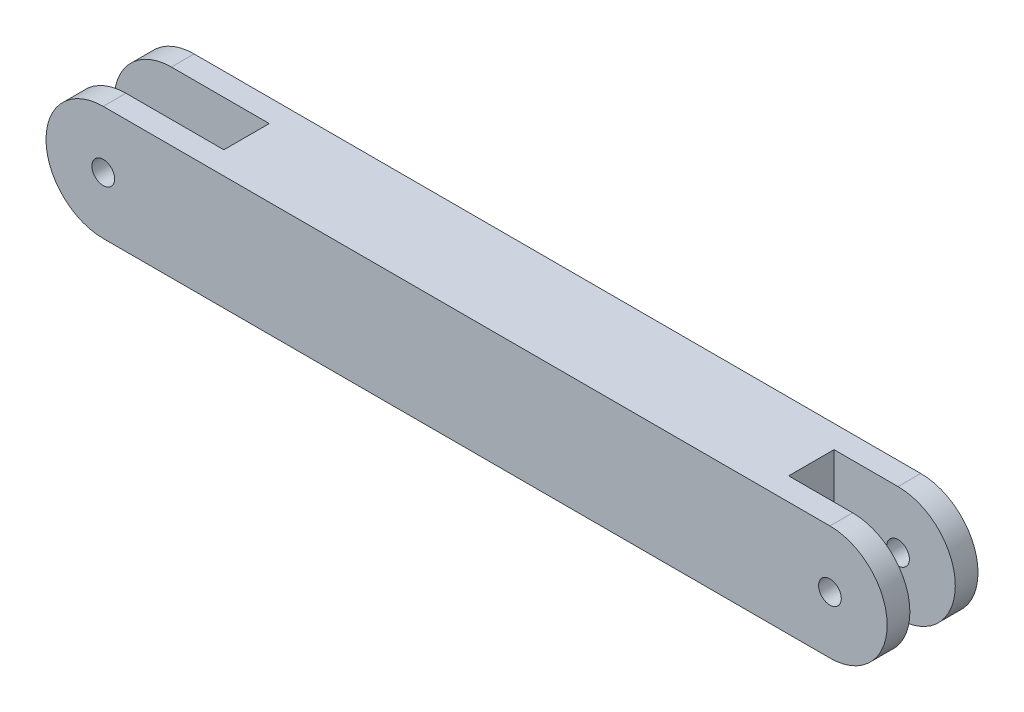
ISO-10303-21;
HEADER;
FILE_DESCRIPTION(('STEP AP214'),'2;1');
FILE_NAME('part.step','',(''),(''),'','','');
FILE_SCHEMA(('AUTOMOTIVE_DESIGN { 1 0 10303 214 1 1 1 1 }'));
ENDSEC;
DATA;
#1=APPLICATION_CONTEXT('core data for automotive mechanical design processes');
#2=APPLICATION_PROTOCOL_DEFINITION('international standard','automotive_design',2000,#1);
#3=PRODUCT_CONTEXT('',#1,'mechanical');
#4=PRODUCT('Part','Part','',(#3));
#5=PRODUCT_RELATED_PRODUCT_CATEGORY('part','',(#4));
#6=PRODUCT_DEFINITION_FORMATION('','',#4);
#7=PRODUCT_DEFINITION_CONTEXT('part definition',#1,'design');
#8=PRODUCT_DEFINITION('design','',#6,#7);
#9=PRODUCT_DEFINITION_SHAPE('','',#8);
#10=(LENGTH_UNIT() NAMED_UNIT(*) SI_UNIT(.MILLI.,.METRE.));
#11=(NAMED_UNIT(*) PLANE_ANGLE_UNIT() SI_UNIT($,.RADIAN.));
#12=(NAMED_UNIT(*) SI_UNIT($,.STERADIAN.) SOLID_ANGLE_UNIT());
#13=UNCERTAINTY_MEASURE_WITH_UNIT(LENGTH_MEASURE(1.E-05),#10,'distance_accuracy_value','');
#14=(GEOMETRIC_REPRESENTATION_CONTEXT(3) GLOBAL_UNCERTAINTY_ASSIGNED_CONTEXT((#13)) GLOBAL_UNIT_ASSIGNED_CONTEXT((#10,
#11,#12)) REPRESENTATION_CONTEXT('',''));
#15=CARTESIAN_POINT('',(0.,0.,0.));
#16=DIRECTION('',(0.,0.,1.));
#17=DIRECTION('',(1.,0.,0.));
#18=AXIS2_PLACEMENT_3D('',#15,#16,#17);
#19=CARTESIAN_POINT('',(-47.2173913043478,-8.07808695652174,6.35));
#20=DIRECTION('',(0.,0.,1.));
#21=DIRECTION('',(1.,0.,0.));
#22=AXIS2_PLACEMENT_3D('',#19,#20,#21);
#23=PLANE('',#22);
#24=DIRECTION('',(0.,1.,0.));
#25=VECTOR('',#24,1.);
#26=CARTESIAN_POINT('',(138.082608695652,-24.0800869565217,6.35));
#27=LINE('',#26,#25);
#28=CARTESIAN_POINT('',(138.082608695652,-24.0800869565217,6.35));
#29=VERTEX_POINT('',#28);
#30=CARTESIAN_POINT('',(138.082608695652,7.92391304347826,6.35));
#31=VERTEX_POINT('',#30);
#32=EDGE_CURVE('E226',#29,#31,#27,.T.);
#33=ORIENTED_EDGE('',*,*,#32,.F.);
#34=DIRECTION('',(1.,0.,0.));
#35=VECTOR('',#34,1.);
#36=CARTESIAN_POINT('',(-47.2173913043478,-24.0800869565217,6.35));
#37=LINE('',#36,#35);
#38=CARTESIAN_POINT('',(155.982608695652,-24.0800869565217,6.35));
#39=VERTEX_POINT('',#38);
#40=EDGE_CURVE('E148',#29,#39,#37,.T.);
#41=ORIENTED_EDGE('',*,*,#40,.T.);
#42=CARTESIAN_POINT('',(155.982608695652,-8.07808695652174,6.35));
#43=DIRECTION('',(0.,0.,1.));
#44=DIRECTION('',(1.,0.,0.));
#45=AXIS2_PLACEMENT_3D('',#42,#43,#44);
#46=CIRCLE('',#45,16.002);
#47=CARTESIAN_POINT('',(155.982608695652,7.92391304347826,6.35));
#48=VERTEX_POINT('',#47);
#49=EDGE_CURVE('E150',#39,#48,#46,.T.);
#50=ORIENTED_EDGE('',*,*,#49,.T.);
#51=DIRECTION('',(-1.,0.,0.));
#52=VECTOR('',#51,1.);
#53=CARTESIAN_POINT('',(-47.2173913043478,7.92391304347826,6.35));
#54=LINE('',#53,#52);
#55=EDGE_CURVE('E68',#48,#31,#54,.T.);
#56=ORIENTED_EDGE('',*,*,#55,.T.);
#57=EDGE_LOOP('',(#33,#41,#50,#56));
#58=FACE_BOUND('',#57,.T.);
#59=CARTESIAN_POINT('',(155.982608695652,-8.07808695652174,6.35));
#60=DIRECTION('',(0.,0.,1.));
#61=DIRECTION('',(1.,0.,0.));
#62=AXIS2_PLACEMENT_3D('',#59,#60,#61);
#63=CIRCLE('',#62,3.175);
#64=CARTESIAN_POINT('',(159.157608695652,-8.07808695652174,6.35));
#65=VERTEX_POINT('',#64);
#66=EDGE_CURVE('E242',#65,#65,#63,.T.);
#67=ORIENTED_EDGE('',*,*,#66,.F.);
#68=EDGE_LOOP('',(#67));
#69=FACE_BOUND('',#68,.T.);
#70=ADVANCED_FACE('F44',(#58,#69),#23,.T.);
#71=CARTESIAN_POINT('',(-47.2173913043478,-24.0800869565217,6.35));
#72=VERTEX_POINT('',#71);
#73=CARTESIAN_POINT('',(-19.8325837068269,-24.0800869565217,6.35));
#74=VERTEX_POINT('',#73);
#75=EDGE_CURVE('E138',#72,#74,#37,.T.);
#76=ORIENTED_EDGE('',*,*,#75,.T.);
#77=DIRECTION('',(0.,-1.,0.));
#78=VECTOR('',#77,1.);
#79=CARTESIAN_POINT('',(-19.8325837068269,7.92391304347826,6.35));
#80=LINE('',#79,#78);
#81=CARTESIAN_POINT('',(-19.8325837068269,7.92391304347826,6.35));
#82=VERTEX_POINT('',#81);
#83=EDGE_CURVE('E136',#82,#74,#80,.T.);
#84=ORIENTED_EDGE('',*,*,#83,.F.);
#85=CARTESIAN_POINT('',(-47.2173913043478,7.92391304347826,6.35));
#86=VERTEX_POINT('',#85);
#87=EDGE_CURVE('E262',#82,#86,#54,.T.);
#88=ORIENTED_EDGE('',*,*,#87,.T.);
#89=CARTESIAN_POINT('',(-47.2173913043478,-8.07808695652174,6.35));
#90=DIRECTION('',(0.,0.,1.));
#91=DIRECTION('',(1.,0.,0.));
#92=AXIS2_PLACEMENT_3D('',#89,#90,#91);
#93=CIRCLE('',#92,16.002);
#94=EDGE_CURVE('E141',#86,#72,#93,.T.);
#95=ORIENTED_EDGE('',*,*,#94,.T.);
#96=EDGE_LOOP('',(#76,#84,#88,#95));
#97=FACE_BOUND('',#96,.T.);
#98=CARTESIAN_POINT('',(-47.2173913043478,-8.07808695652174,6.35));
#99=DIRECTION('',(0.,0.,1.));
#100=DIRECTION('',(1.,0.,0.));
#101=AXIS2_PLACEMENT_3D('',#98,#99,#100);
#102=CIRCLE('',#101,3.175);
#103=CARTESIAN_POINT('',(-44.0423913043478,-8.07808695652174,6.35));
#104=VERTEX_POINT('',#103);
#105=EDGE_CURVE('E255',#104,#104,#102,.T.);
#106=ORIENTED_EDGE('',*,*,#105,.F.);
#107=EDGE_LOOP('',(#106));
#108=FACE_BOUND('',#107,.T.);
#109=ADVANCED_FACE('F137',(#97,#108),#23,.T.);
#110=CARTESIAN_POINT('',(-47.2173913043478,-8.07808695652174,0.));
#111=DIRECTION('',(0.,0.,1.));
#112=DIRECTION('',(1.,0.,0.));
#113=AXIS2_PLACEMENT_3D('',#110,#111,#112);
#114=PLANE('',#113);
#115=CARTESIAN_POINT('',(-47.2173913043478,-8.07808695652174,0.));
#116=DIRECTION('',(0.,0.,1.));
#117=DIRECTION('',(1.,0.,0.));
#118=AXIS2_PLACEMENT_3D('',#115,#116,#117);
#119=CIRCLE('',#118,16.002);
#120=CARTESIAN_POINT('',(-47.2173913043478,7.92391304347826,0.));
#121=VERTEX_POINT('',#120);
#122=CARTESIAN_POINT('',(-47.2173913043478,-24.0800869565217,0.));
#123=VERTEX_POINT('',#122);
#124=EDGE_CURVE('E259',#121,#123,#119,.T.);
#125=ORIENTED_EDGE('',*,*,#124,.F.);
#126=DIRECTION('',(-1.,0.,0.));
#127=VECTOR('',#126,1.);
#128=CARTESIAN_POINT('',(-47.2173913043478,7.92391304347826,0.));
#129=LINE('',#128,#127);
#130=CARTESIAN_POINT('',(155.982608695652,7.92391304347826,0.));
#131=VERTEX_POINT('',#130);
#132=EDGE_CURVE('E264',#131,#121,#129,.T.);
#133=ORIENTED_EDGE('',*,*,#132,.F.);
#134=CARTESIAN_POINT('',(155.982608695652,-8.07808695652174,0.));
#135=DIRECTION('',(0.,0.,1.));
#136=DIRECTION('',(1.,0.,0.));
#137=AXIS2_PLACEMENT_3D('',#134,#135,#136);
#138=CIRCLE('',#137,16.002);
#139=CARTESIAN_POINT('',(155.982608695652,-24.0800869565217,0.));
#140=VERTEX_POINT('',#139);
#141=EDGE_CURVE('E273',#140,#131,#138,.T.);
#142=ORIENTED_EDGE('',*,*,#141,.F.);
#143=DIRECTION('',(1.,0.,0.));
#144=VECTOR('',#143,1.);
#145=CARTESIAN_POINT('',(-47.2173913043478,-24.0800869565217,0.));
#146=LINE('',#145,#144);
#147=EDGE_CURVE('E275',#123,#140,#146,.T.);
#148=ORIENTED_EDGE('',*,*,#147,.F.);
#149=EDGE_LOOP('',(#125,#133,#142,#148));
#150=FACE_BOUND('',#149,.T.);
#151=CARTESIAN_POINT('',(-47.2173913043478,-8.07808695652174,0.));
#152=DIRECTION('',(0.,0.,1.));
#153=DIRECTION('',(1.,0.,0.));
#154=AXIS2_PLACEMENT_3D('',#151,#152,#153);
#155=CIRCLE('',#154,3.175);
#156=CARTESIAN_POINT('',(-44.0423913043478,-8.07808695652174,0.));
#157=VERTEX_POINT('',#156);
#158=EDGE_CURVE('E247',#157,#157,#155,.T.);
#159=ORIENTED_EDGE('',*,*,#158,.T.);
#160=EDGE_LOOP('',(#159));
#161=FACE_BOUND('',#160,.T.);
#162=CARTESIAN_POINT('',(155.982608695652,-8.07808695652174,0.));
#163=DIRECTION('',(0.,0.,1.));
#164=DIRECTION('',(1.,0.,0.));
#165=AXIS2_PLACEMENT_3D('',#162,#163,#164);
#166=CIRCLE('',#165,3.175);
#167=CARTESIAN_POINT('',(159.157608695652,-8.07808695652174,0.));
#168=VERTEX_POINT('',#167);
#169=EDGE_CURVE('E243',#168,#168,#166,.T.);
#170=ORIENTED_EDGE('',*,*,#169,.T.);
#171=EDGE_LOOP('',(#170));
#172=FACE_BOUND('',#171,.T.);
#173=ADVANCED_FACE('F296',(#150,#161,#172),#114,.F.);
#174=CARTESIAN_POINT('',(-47.2173913043478,-8.07808695652174,6.35));
#175=DIRECTION('',(0.,0.,-1.));
#176=DIRECTION('',(-1.,0.,0.));
#177=AXIS2_PLACEMENT_3D('',#174,#175,#176);
#178=CYLINDRICAL_SURFACE('',#177,16.002);
#179=ORIENTED_EDGE('',*,*,#124,.T.);
#180=DIRECTION('',(0.,0.,-1.));
#181=VECTOR('',#180,1.);
#182=CARTESIAN_POINT('',(-47.2173913043478,-24.0800869565217,6.35));
#183=LINE('',#182,#181);
#184=EDGE_CURVE('E11',#72,#123,#183,.T.);
#185=ORIENTED_EDGE('',*,*,#184,.F.);
#186=ORIENTED_EDGE('',*,*,#94,.F.);
#187=DIRECTION('',(0.,0.,-1.));
#188=VECTOR('',#187,1.);
#189=CARTESIAN_POINT('',(-47.2173913043478,7.92391304347826,6.35));
#190=LINE('',#189,#188);
#191=EDGE_CURVE('E267',#86,#121,#190,.T.);
#192=ORIENTED_EDGE('',*,*,#191,.T.);
#193=EDGE_LOOP('',(#179,#185,#186,#192));
#194=FACE_BOUND('',#193,.T.);
#195=ADVANCED_FACE('F50',(#194),#178,.T.);
#196=CARTESIAN_POINT('',(-47.2173913043478,-24.0800869565217,6.35));
#197=DIRECTION('',(0.,1.,0.));
#198=DIRECTION('',(0.,0.,1.));
#199=AXIS2_PLACEMENT_3D('',#196,#197,#198);
#200=PLANE('',#199);
#201=DIRECTION('',(0.,0.,1.));
#202=VECTOR('',#201,1.);
#203=CARTESIAN_POINT('',(-19.8325837068269,-24.0800869565217,6.35));
#204=LINE('',#203,#202);
#205=CARTESIAN_POINT('',(-19.8325837068269,-24.0800869565217,19.05));
#206=VERTEX_POINT('',#205);
#207=EDGE_CURVE('E153',#74,#206,#204,.T.);
#208=ORIENTED_EDGE('',*,*,#207,.F.);
#209=ORIENTED_EDGE('',*,*,#75,.F.);
#210=ORIENTED_EDGE('',*,*,#184,.T.);
#211=ORIENTED_EDGE('',*,*,#147,.T.);
#212=DIRECTION('',(0.,0.,-1.));
#213=VECTOR('',#212,1.);
#214=CARTESIAN_POINT('',(155.982608695652,-24.0800869565217,6.35));
#215=LINE('',#214,#213);
#216=EDGE_CURVE('E53',#39,#140,#215,.T.);
#217=ORIENTED_EDGE('',*,*,#216,.F.);
#218=ORIENTED_EDGE('',*,*,#40,.F.);
#219=DIRECTION('',(0.,0.,-1.));
#220=VECTOR('',#219,1.);
#221=CARTESIAN_POINT('',(138.082608695652,-24.0800869565217,19.05));
#222=LINE('',#221,#220);
#223=CARTESIAN_POINT('',(138.082608695652,-24.0800869565217,19.05));
#224=VERTEX_POINT('',#223);
#225=EDGE_CURVE('E237',#224,#29,#222,.T.);
#226=ORIENTED_EDGE('',*,*,#225,.F.);
#227=DIRECTION('',(1.,0.,0.));
#228=VECTOR('',#227,1.);
#229=CARTESIAN_POINT('',(-47.2173913043478,-24.0800869565217,19.05));
#230=LINE('',#229,#228);
#231=CARTESIAN_POINT('',(155.982608695652,-24.0800869565217,19.05));
#232=VERTEX_POINT('',#231);
#233=EDGE_CURVE('E201',#224,#232,#230,.T.);
#234=ORIENTED_EDGE('',*,*,#233,.T.);
#235=DIRECTION('',(0.,0.,-1.));
#236=VECTOR('',#235,1.);
#237=CARTESIAN_POINT('',(155.982608695652,-24.0800869565217,25.4));
#238=LINE('',#237,#236);
#239=CARTESIAN_POINT('',(155.982608695652,-24.0800869565217,25.4));
#240=VERTEX_POINT('',#239);
#241=EDGE_CURVE('E223',#240,#232,#238,.T.);
#242=ORIENTED_EDGE('',*,*,#241,.F.);
#243=DIRECTION('',(1.,0.,0.));
#244=VECTOR('',#243,1.);
#245=CARTESIAN_POINT('',(-47.2173913043478,-24.0800869565217,25.4));
#246=LINE('',#245,#244);
#247=CARTESIAN_POINT('',(-47.2173913043478,-24.0800869565217,25.4));
#248=VERTEX_POINT('',#247);
#249=EDGE_CURVE('E194',#248,#240,#246,.T.);
#250=ORIENTED_EDGE('',*,*,#249,.F.);
#251=DIRECTION('',(0.,0.,-1.));
#252=VECTOR('',#251,1.);
#253=CARTESIAN_POINT('',(-47.2173913043478,-24.0800869565217,25.4));
#254=LINE('',#253,#252);
#255=CARTESIAN_POINT('',(-47.2173913043478,-24.0800869565217,19.05));
#256=VERTEX_POINT('',#255);
#257=EDGE_CURVE('E221',#248,#256,#254,.T.);
#258=ORIENTED_EDGE('',*,*,#257,.T.);
#259=EDGE_CURVE('E163',#256,#206,#230,.T.);
#260=ORIENTED_EDGE('',*,*,#259,.T.);
#261=EDGE_LOOP('',(#208,#209,#210,#211,#217,#218,#226,#234,#242,#250,#258,#260));
#262=FACE_BOUND('',#261,.T.);
#263=ADVANCED_FACE('F160',(#262),#200,.F.);
#264=CARTESIAN_POINT('',(155.982608695652,-8.07808695652174,6.35));
#265=DIRECTION('',(0.,0.,-1.));
#266=DIRECTION('',(-1.,0.,0.));
#267=AXIS2_PLACEMENT_3D('',#264,#265,#266);
#268=CYLINDRICAL_SURFACE('',#267,16.002);
#269=ORIENTED_EDGE('',*,*,#141,.T.);
#270=DIRECTION('',(0.,0.,-1.));
#271=VECTOR('',#270,1.);
#272=CARTESIAN_POINT('',(155.982608695652,7.92391304347826,6.35));
#273=LINE('',#272,#271);
#274=EDGE_CURVE('E285',#48,#131,#273,.T.);
#275=ORIENTED_EDGE('',*,*,#274,.F.);
#276=ORIENTED_EDGE('',*,*,#49,.F.);
#277=ORIENTED_EDGE('',*,*,#216,.T.);
#278=EDGE_LOOP('',(#269,#275,#276,#277));
#279=FACE_BOUND('',#278,.T.);
#280=ADVANCED_FACE('F292',(#279),#268,.T.);
#281=CARTESIAN_POINT('',(-47.2173913043478,7.92391304347826,6.35));
#282=DIRECTION('',(0.,-1.,0.));
#283=DIRECTION('',(0.,0.,-1.));
#284=AXIS2_PLACEMENT_3D('',#281,#282,#283);
#285=PLANE('',#284);
#286=DIRECTION('',(0.,0.,-1.));
#287=VECTOR('',#286,1.);
#288=CARTESIAN_POINT('',(-19.8325837068269,7.92391304347826,6.35));
#289=LINE('',#288,#287);
#290=CARTESIAN_POINT('',(-19.8325837068269,7.92391304347826,19.05));
#291=VERTEX_POINT('',#290);
#292=EDGE_CURVE('E158',#291,#82,#289,.T.);
#293=ORIENTED_EDGE('',*,*,#292,.F.);
#294=DIRECTION('',(-1.,0.,0.));
#295=VECTOR('',#294,1.);
#296=CARTESIAN_POINT('',(-47.2173913043478,7.92391304347826,19.05));
#297=LINE('',#296,#295);
#298=CARTESIAN_POINT('',(-47.2173913043478,7.92391304347826,19.05));
#299=VERTEX_POINT('',#298);
#300=EDGE_CURVE('E64',#291,#299,#297,.T.);
#301=ORIENTED_EDGE('',*,*,#300,.T.);
#302=DIRECTION('',(0.,0.,-1.));
#303=VECTOR('',#302,1.);
#304=CARTESIAN_POINT('',(-47.2173913043478,7.92391304347826,25.4));
#305=LINE('',#304,#303);
#306=CARTESIAN_POINT('',(-47.2173913043478,7.92391304347826,25.4));
#307=VERTEX_POINT('',#306);
#308=EDGE_CURVE('E203',#307,#299,#305,.T.);
#309=ORIENTED_EDGE('',*,*,#308,.F.);
#310=DIRECTION('',(-1.,0.,0.));
#311=VECTOR('',#310,1.);
#312=CARTESIAN_POINT('',(-47.2173913043478,7.92391304347826,25.4));
#313=LINE('',#312,#311);
#314=CARTESIAN_POINT('',(155.982608695652,7.92391304347826,25.4));
#315=VERTEX_POINT('',#314);
#316=EDGE_CURVE('E200',#315,#307,#313,.T.);
#317=ORIENTED_EDGE('',*,*,#316,.F.);
#318=DIRECTION('',(0.,0.,-1.));
#319=VECTOR('',#318,1.);
#320=CARTESIAN_POINT('',(155.982608695652,7.92391304347826,25.4));
#321=LINE('',#320,#319);
#322=CARTESIAN_POINT('',(155.982608695652,7.92391304347826,19.05));
#323=VERTEX_POINT('',#322);
#324=EDGE_CURVE('E216',#315,#323,#321,.T.);
#325=ORIENTED_EDGE('',*,*,#324,.T.);
#326=CARTESIAN_POINT('',(138.082608695652,7.92391304347826,19.05));
#327=VERTEX_POINT('',#326);
#328=EDGE_CURVE('E191',#323,#327,#297,.T.);
#329=ORIENTED_EDGE('',*,*,#328,.T.);
#330=DIRECTION('',(0.,0.,-1.));
#331=VECTOR('',#330,1.);
#332=CARTESIAN_POINT('',(138.082608695652,7.92391304347826,19.05));
#333=LINE('',#332,#331);
#334=EDGE_CURVE('E231',#327,#31,#333,.T.);
#335=ORIENTED_EDGE('',*,*,#334,.T.);
#336=ORIENTED_EDGE('',*,*,#55,.F.);
#337=ORIENTED_EDGE('',*,*,#274,.T.);
#338=ORIENTED_EDGE('',*,*,#132,.T.);
#339=ORIENTED_EDGE('',*,*,#191,.F.);
#340=ORIENTED_EDGE('',*,*,#87,.F.);
#341=EDGE_LOOP('',(#293,#301,#309,#317,#325,#329,#335,#336,#337,#338,#339,#340));
#342=FACE_BOUND('',#341,.T.);
#343=ADVANCED_FACE('F305',(#342),#285,.F.);
#344=CARTESIAN_POINT('',(-47.2173913043478,-8.07808695652174,6.35));
#345=DIRECTION('',(0.,0.,-1.));
#346=DIRECTION('',(-1.,0.,0.));
#347=AXIS2_PLACEMENT_3D('',#344,#345,#346);
#348=CYLINDRICAL_SURFACE('',#347,3.175);
#349=ORIENTED_EDGE('',*,*,#105,.T.);
#350=EDGE_LOOP('',(#349));
#351=FACE_BOUND('',#350,.T.);
#352=ORIENTED_EDGE('',*,*,#158,.F.);
#353=EDGE_LOOP('',(#352));
#354=FACE_BOUND('',#353,.T.);
#355=ADVANCED_FACE('F318',(#351,#354),#348,.F.);
#356=CARTESIAN_POINT('',(155.982608695652,-8.07808695652174,6.35));
#357=DIRECTION('',(0.,0.,-1.));
#358=DIRECTION('',(-1.,0.,0.));
#359=AXIS2_PLACEMENT_3D('',#356,#357,#358);
#360=CYLINDRICAL_SURFACE('',#359,3.175);
#361=ORIENTED_EDGE('',*,*,#66,.T.);
#362=EDGE_LOOP('',(#361));
#363=FACE_BOUND('',#362,.T.);
#364=ORIENTED_EDGE('',*,*,#169,.F.);
#365=EDGE_LOOP('',(#364));
#366=FACE_BOUND('',#365,.T.);
#367=ADVANCED_FACE('F331',(#363,#366),#360,.F.);
#368=CARTESIAN_POINT('',(138.082608695652,-24.0800869565217,19.05));
#369=DIRECTION('',(-1.,0.,0.));
#370=DIRECTION('',(0.,0.,1.));
#371=AXIS2_PLACEMENT_3D('',#368,#369,#370);
#372=PLANE('',#371);
#373=ORIENTED_EDGE('',*,*,#32,.T.);
#374=ORIENTED_EDGE('',*,*,#334,.F.);
#375=DIRECTION('',(0.,1.,0.));
#376=VECTOR('',#375,1.);
#377=CARTESIAN_POINT('',(138.082608695652,-24.0800869565217,19.05));
#378=LINE('',#377,#376);
#379=EDGE_CURVE('E230',#224,#327,#378,.T.);
#380=ORIENTED_EDGE('',*,*,#379,.F.);
#381=ORIENTED_EDGE('',*,*,#225,.T.);
#382=EDGE_LOOP('',(#373,#374,#380,#381));
#383=FACE_BOUND('',#382,.T.);
#384=ADVANCED_FACE('F341',(#383),#372,.F.);
#385=CARTESIAN_POINT('',(-47.2173913043478,-8.07808695652174,19.05));
#386=DIRECTION('',(0.,0.,1.));
#387=DIRECTION('',(1.,0.,0.));
#388=AXIS2_PLACEMENT_3D('',#385,#386,#387);
#389=PLANE('',#388);
#390=CARTESIAN_POINT('',(-47.2173913043478,-8.07808695652174,19.05));
#391=DIRECTION('',(0.,0.,1.));
#392=DIRECTION('',(1.,0.,0.));
#393=AXIS2_PLACEMENT_3D('',#390,#391,#392);
#394=CIRCLE('',#393,3.175);
#395=CARTESIAN_POINT('',(-44.0423913043478,-8.07808695652174,19.05));
#396=VERTEX_POINT('',#395);
#397=EDGE_CURVE('E174',#396,#396,#394,.T.);
#398=ORIENTED_EDGE('',*,*,#397,.T.);
#399=EDGE_LOOP('',(#398));
#400=FACE_BOUND('',#399,.T.);
#401=ORIENTED_EDGE('',*,*,#300,.F.);
#402=DIRECTION('',(0.,1.,0.));
#403=VECTOR('',#402,1.);
#404=CARTESIAN_POINT('',(-19.8325837068269,7.92391304347826,19.05));
#405=LINE('',#404,#403);
#406=EDGE_CURVE('E161',#206,#291,#405,.T.);
#407=ORIENTED_EDGE('',*,*,#406,.F.);
#408=ORIENTED_EDGE('',*,*,#259,.F.);
#409=CARTESIAN_POINT('',(-47.2173913043478,-8.07808695652174,19.05));
#410=DIRECTION('',(0.,0.,1.));
#411=DIRECTION('',(1.,0.,0.));
#412=AXIS2_PLACEMENT_3D('',#409,#410,#411);
#413=CIRCLE('',#412,16.002);
#414=EDGE_CURVE('E182',#299,#256,#413,.T.);
#415=ORIENTED_EDGE('',*,*,#414,.F.);
#416=EDGE_LOOP('',(#401,#407,#408,#415));
#417=FACE_BOUND('',#416,.T.);
#418=ADVANCED_FACE('F374',(#400,#417),#389,.F.);
#419=CARTESIAN_POINT('',(155.982608695652,-8.07808695652174,19.05));
#420=DIRECTION('',(0.,0.,1.));
#421=DIRECTION('',(1.,0.,0.));
#422=AXIS2_PLACEMENT_3D('',#419,#420,#421);
#423=CIRCLE('',#422,3.175);
#424=CARTESIAN_POINT('',(159.157608695652,-8.07808695652174,19.05));
#425=VERTEX_POINT('',#424);
#426=EDGE_CURVE('E167',#425,#425,#423,.T.);
#427=ORIENTED_EDGE('',*,*,#426,.T.);
#428=EDGE_LOOP('',(#427));
#429=FACE_BOUND('',#428,.T.);
#430=ORIENTED_EDGE('',*,*,#233,.F.);
#431=ORIENTED_EDGE('',*,*,#379,.T.);
#432=ORIENTED_EDGE('',*,*,#328,.F.);
#433=CARTESIAN_POINT('',(155.982608695652,-8.07808695652174,19.05));
#434=DIRECTION('',(0.,0.,1.));
#435=DIRECTION('',(1.,0.,0.));
#436=AXIS2_PLACEMENT_3D('',#433,#434,#435);
#437=CIRCLE('',#436,16.002);
#438=EDGE_CURVE('E206',#232,#323,#437,.T.);
#439=ORIENTED_EDGE('',*,*,#438,.F.);
#440=EDGE_LOOP('',(#430,#431,#432,#439));
#441=FACE_BOUND('',#440,.T.);
#442=ADVANCED_FACE('F385',(#429,#441),#389,.F.);
#443=CARTESIAN_POINT('',(-47.2173913043478,-8.07808695652174,25.4));
#444=DIRECTION('',(0.,0.,1.));
#445=DIRECTION('',(1.,0.,0.));
#446=AXIS2_PLACEMENT_3D('',#443,#444,#445);
#447=PLANE('',#446);
#448=CARTESIAN_POINT('',(-47.2173913043478,-8.07808695652174,25.4));
#449=DIRECTION('',(0.,0.,1.));
#450=DIRECTION('',(1.,0.,0.));
#451=AXIS2_PLACEMENT_3D('',#448,#449,#450);
#452=CIRCLE('',#451,3.175);
#453=CARTESIAN_POINT('',(-44.0423913043478,-8.07808695652174,25.4));
#454=VERTEX_POINT('',#453);
#455=EDGE_CURVE('E177',#454,#454,#452,.T.);
#456=ORIENTED_EDGE('',*,*,#455,.F.);
#457=EDGE_LOOP('',(#456));
#458=FACE_BOUND('',#457,.T.);
#459=CARTESIAN_POINT('',(-47.2173913043478,-8.07808695652174,25.4));
#460=DIRECTION('',(0.,0.,1.));
#461=DIRECTION('',(1.,0.,0.));
#462=AXIS2_PLACEMENT_3D('',#459,#460,#461);
#463=CIRCLE('',#462,16.002);
#464=EDGE_CURVE('E190',#307,#248,#463,.T.);
#465=ORIENTED_EDGE('',*,*,#464,.T.);
#466=ORIENTED_EDGE('',*,*,#249,.T.);
#467=CARTESIAN_POINT('',(155.982608695652,-8.07808695652174,25.4));
#468=DIRECTION('',(0.,0.,1.));
#469=DIRECTION('',(1.,0.,0.));
#470=AXIS2_PLACEMENT_3D('',#467,#468,#469);
#471=CIRCLE('',#470,16.002);
#472=EDGE_CURVE('E192',#240,#315,#471,.T.);
#473=ORIENTED_EDGE('',*,*,#472,.T.);
#474=ORIENTED_EDGE('',*,*,#316,.T.);
#475=EDGE_LOOP('',(#465,#466,#473,#474));
#476=FACE_BOUND('',#475,.T.);
#477=CARTESIAN_POINT('',(155.982608695652,-8.07808695652174,25.4));
#478=DIRECTION('',(0.,0.,1.));
#479=DIRECTION('',(1.,0.,0.));
#480=AXIS2_PLACEMENT_3D('',#477,#478,#479);
#481=CIRCLE('',#480,3.175);
#482=CARTESIAN_POINT('',(159.157608695652,-8.07808695652174,25.4));
#483=VERTEX_POINT('',#482);
#484=EDGE_CURVE('E171',#483,#483,#481,.T.);
#485=ORIENTED_EDGE('',*,*,#484,.F.);
#486=EDGE_LOOP('',(#485));
#487=FACE_BOUND('',#486,.T.);
#488=ADVANCED_FACE('F389',(#458,#476,#487),#447,.T.);
#489=CARTESIAN_POINT('',(-47.2173913043478,-8.07808695652174,25.4));
#490=DIRECTION('',(0.,0.,-1.));
#491=DIRECTION('',(-1.,0.,0.));
#492=AXIS2_PLACEMENT_3D('',#489,#490,#491);
#493=CYLINDRICAL_SURFACE('',#492,16.002);
#494=ORIENTED_EDGE('',*,*,#414,.T.);
#495=ORIENTED_EDGE('',*,*,#257,.F.);
#496=ORIENTED_EDGE('',*,*,#464,.F.);
#497=ORIENTED_EDGE('',*,*,#308,.T.);
#498=EDGE_LOOP('',(#494,#495,#496,#497));
#499=FACE_BOUND('',#498,.T.);
#500=ADVANCED_FACE('F392',(#499),#493,.T.);
#501=CARTESIAN_POINT('',(155.982608695652,-8.07808695652174,25.4));
#502=DIRECTION('',(0.,0.,-1.));
#503=DIRECTION('',(-1.,0.,0.));
#504=AXIS2_PLACEMENT_3D('',#501,#502,#503);
#505=CYLINDRICAL_SURFACE('',#504,16.002);
#506=ORIENTED_EDGE('',*,*,#438,.T.);
#507=ORIENTED_EDGE('',*,*,#324,.F.);
#508=ORIENTED_EDGE('',*,*,#472,.F.);
#509=ORIENTED_EDGE('',*,*,#241,.T.);
#510=EDGE_LOOP('',(#506,#507,#508,#509));
#511=FACE_BOUND('',#510,.T.);
#512=ADVANCED_FACE('F404',(#511),#505,.T.);
#513=CARTESIAN_POINT('',(-47.2173913043478,-8.07808695652174,25.4));
#514=DIRECTION('',(0.,0.,-1.));
#515=DIRECTION('',(-1.,0.,0.));
#516=AXIS2_PLACEMENT_3D('',#513,#514,#515);
#517=CYLINDRICAL_SURFACE('',#516,3.175);
#518=ORIENTED_EDGE('',*,*,#455,.T.);
#519=EDGE_LOOP('',(#518));
#520=FACE_BOUND('',#519,.T.);
#521=ORIENTED_EDGE('',*,*,#397,.F.);
#522=EDGE_LOOP('',(#521));
#523=FACE_BOUND('',#522,.T.);
#524=ADVANCED_FACE('F415',(#520,#523),#517,.F.);
#525=CARTESIAN_POINT('',(155.982608695652,-8.07808695652174,25.4));
#526=DIRECTION('',(0.,0.,-1.));
#527=DIRECTION('',(-1.,0.,0.));
#528=AXIS2_PLACEMENT_3D('',#525,#526,#527);
#529=CYLINDRICAL_SURFACE('',#528,3.175);
#530=ORIENTED_EDGE('',*,*,#484,.T.);
#531=EDGE_LOOP('',(#530));
#532=FACE_BOUND('',#531,.T.);
#533=ORIENTED_EDGE('',*,*,#426,.F.);
#534=EDGE_LOOP('',(#533));
#535=FACE_BOUND('',#534,.T.);
#536=ADVANCED_FACE('F422',(#532,#535),#529,.F.);
#537=CARTESIAN_POINT('',(-19.8325837068269,0.,0.));
#538=DIRECTION('',(-1.,0.,0.));
#539=DIRECTION('',(0.,0.,1.));
#540=AXIS2_PLACEMENT_3D('',#537,#538,#539);
#541=PLANE('',#540);
#542=ORIENTED_EDGE('',*,*,#83,.T.);
#543=ORIENTED_EDGE('',*,*,#207,.T.);
#544=ORIENTED_EDGE('',*,*,#406,.T.);
#545=ORIENTED_EDGE('',*,*,#292,.T.);
#546=EDGE_LOOP('',(#542,#543,#544,#545));
#547=FACE_BOUND('',#546,.T.);
#548=ADVANCED_FACE('F155',(#547),#541,.T.);
#549=CLOSED_SHELL('',(#70,#109,#173,#195,#263,#280,#343,#355,#367,#384,#418,#442,#488,#500,#512,
#524,#536,#548));
#550=MANIFOLD_SOLID_BREP('B2',#549);
#551=ADVANCED_BREP_SHAPE_REPRESENTATION('',(#18,#550),#14);
#552=SHAPE_DEFINITION_REPRESENTATION(#9,#551);
ENDSEC;
END-ISO-10303-21;
